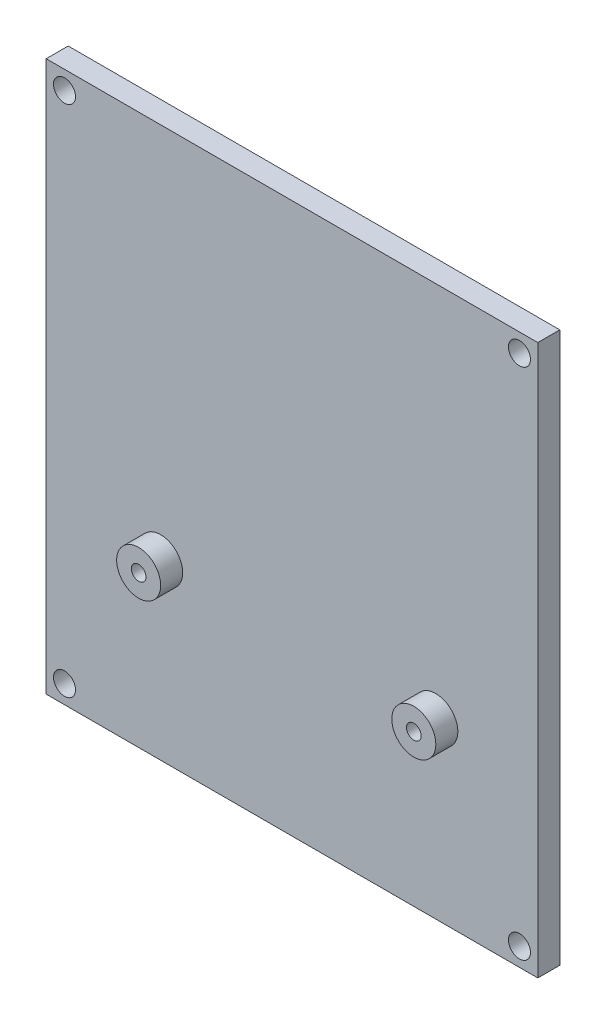
ISO-10303-21;
HEADER;
FILE_DESCRIPTION(('STEP AP214'),'2;1');
FILE_NAME('part.step','',(''),(''),'','','');
FILE_SCHEMA(('AUTOMOTIVE_DESIGN { 1 0 10303 214 1 1 1 1 }'));
ENDSEC;
DATA;
#1=APPLICATION_CONTEXT('core data for automotive mechanical design processes');
#2=APPLICATION_PROTOCOL_DEFINITION('international standard','automotive_design',2000,#1);
#3=PRODUCT_CONTEXT('',#1,'mechanical');
#4=PRODUCT('Part','Part','',(#3));
#5=PRODUCT_RELATED_PRODUCT_CATEGORY('part','',(#4));
#6=PRODUCT_DEFINITION_FORMATION('','',#4);
#7=PRODUCT_DEFINITION_CONTEXT('part definition',#1,'design');
#8=PRODUCT_DEFINITION('design','',#6,#7);
#9=PRODUCT_DEFINITION_SHAPE('','',#8);
#10=(LENGTH_UNIT() NAMED_UNIT(*) SI_UNIT(.MILLI.,.METRE.));
#11=(NAMED_UNIT(*) PLANE_ANGLE_UNIT() SI_UNIT($,.RADIAN.));
#12=(NAMED_UNIT(*) SI_UNIT($,.STERADIAN.) SOLID_ANGLE_UNIT());
#13=UNCERTAINTY_MEASURE_WITH_UNIT(LENGTH_MEASURE(1.E-05),#10,'distance_accuracy_value','');
#14=(GEOMETRIC_REPRESENTATION_CONTEXT(3) GLOBAL_UNCERTAINTY_ASSIGNED_CONTEXT((#13)) GLOBAL_UNIT_ASSIGNED_CONTEXT((#10,
#11,#12)) REPRESENTATION_CONTEXT('',''));
#15=CARTESIAN_POINT('',(0.,0.,0.));
#16=DIRECTION('',(0.,0.,1.));
#17=DIRECTION('',(1.,0.,0.));
#18=AXIS2_PLACEMENT_3D('',#15,#16,#17);
#19=CARTESIAN_POINT('',(33.5,-37.5,3.));
#20=DIRECTION('',(-1.,0.,0.));
#21=DIRECTION('',(0.,0.,1.));
#22=AXIS2_PLACEMENT_3D('',#19,#20,#21);
#23=PLANE('',#22);
#24=DIRECTION('',(0.,1.,0.));
#25=VECTOR('',#24,1.);
#26=CARTESIAN_POINT('',(33.5,-37.5,0.));
#27=LINE('',#26,#25);
#28=CARTESIAN_POINT('',(33.5,-37.5,0.));
#29=VERTEX_POINT('',#28);
#30=CARTESIAN_POINT('',(33.5,37.5,0.));
#31=VERTEX_POINT('',#30);
#32=EDGE_CURVE('E115',#29,#31,#27,.T.);
#33=ORIENTED_EDGE('',*,*,#32,.T.);
#34=DIRECTION('',(0.,0.,-1.));
#35=VECTOR('',#34,1.);
#36=CARTESIAN_POINT('',(33.5,37.5,3.));
#37=LINE('',#36,#35);
#38=CARTESIAN_POINT('',(33.5,37.5,3.));
#39=VERTEX_POINT('',#38);
#40=EDGE_CURVE('E104',#39,#31,#37,.T.);
#41=ORIENTED_EDGE('',*,*,#40,.F.);
#42=DIRECTION('',(0.,1.,0.));
#43=VECTOR('',#42,1.);
#44=CARTESIAN_POINT('',(33.5,-37.5,3.));
#45=LINE('',#44,#43);
#46=CARTESIAN_POINT('',(33.5,-37.5,3.));
#47=VERTEX_POINT('',#46);
#48=EDGE_CURVE('E96',#47,#39,#45,.T.);
#49=ORIENTED_EDGE('',*,*,#48,.F.);
#50=DIRECTION('',(0.,0.,-1.));
#51=VECTOR('',#50,1.);
#52=CARTESIAN_POINT('',(33.5,-37.5,3.));
#53=LINE('',#52,#51);
#54=EDGE_CURVE('E111',#47,#29,#53,.T.);
#55=ORIENTED_EDGE('',*,*,#54,.T.);
#56=EDGE_LOOP('',(#33,#41,#49,#55));
#57=FACE_BOUND('',#56,.T.);
#58=ADVANCED_FACE('F43',(#57),#23,.F.);
#59=CARTESIAN_POINT('',(-33.5,37.5,3.));
#60=DIRECTION('',(0.,-1.,0.));
#61=DIRECTION('',(0.,0.,-1.));
#62=AXIS2_PLACEMENT_3D('',#59,#60,#61);
#63=PLANE('',#62);
#64=DIRECTION('',(-1.,0.,0.));
#65=VECTOR('',#64,1.);
#66=CARTESIAN_POINT('',(-33.5,37.5,0.));
#67=LINE('',#66,#65);
#68=CARTESIAN_POINT('',(-33.5,37.5,0.));
#69=VERTEX_POINT('',#68);
#70=EDGE_CURVE('E102',#31,#69,#67,.T.);
#71=ORIENTED_EDGE('',*,*,#70,.T.);
#72=DIRECTION('',(0.,0.,-1.));
#73=VECTOR('',#72,1.);
#74=CARTESIAN_POINT('',(-33.5,37.5,3.));
#75=LINE('',#74,#73);
#76=CARTESIAN_POINT('',(-33.5,37.5,3.));
#77=VERTEX_POINT('',#76);
#78=EDGE_CURVE('E100',#77,#69,#75,.T.);
#79=ORIENTED_EDGE('',*,*,#78,.F.);
#80=DIRECTION('',(-1.,0.,0.));
#81=VECTOR('',#80,1.);
#82=CARTESIAN_POINT('',(-33.5,37.5,3.));
#83=LINE('',#82,#81);
#84=EDGE_CURVE('E91',#39,#77,#83,.T.);
#85=ORIENTED_EDGE('',*,*,#84,.F.);
#86=ORIENTED_EDGE('',*,*,#40,.T.);
#87=EDGE_LOOP('',(#71,#79,#85,#86));
#88=FACE_BOUND('',#87,.T.);
#89=ADVANCED_FACE('F101',(#88),#63,.F.);
#90=CARTESIAN_POINT('',(-33.5,-37.5,3.));
#91=DIRECTION('',(1.,0.,0.));
#92=DIRECTION('',(0.,0.,-1.));
#93=AXIS2_PLACEMENT_3D('',#90,#91,#92);
#94=PLANE('',#93);
#95=DIRECTION('',(0.,-1.,0.));
#96=VECTOR('',#95,1.);
#97=CARTESIAN_POINT('',(-33.5,-37.5,0.));
#98=LINE('',#97,#96);
#99=CARTESIAN_POINT('',(-33.5,-37.5,0.));
#100=VERTEX_POINT('',#99);
#101=EDGE_CURVE('E77',#69,#100,#98,.T.);
#102=ORIENTED_EDGE('',*,*,#101,.T.);
#103=DIRECTION('',(0.,0.,-1.));
#104=VECTOR('',#103,1.);
#105=CARTESIAN_POINT('',(-33.5,-37.5,3.));
#106=LINE('',#105,#104);
#107=CARTESIAN_POINT('',(-33.5,-37.5,3.));
#108=VERTEX_POINT('',#107);
#109=EDGE_CURVE('E105',#108,#100,#106,.T.);
#110=ORIENTED_EDGE('',*,*,#109,.F.);
#111=DIRECTION('',(0.,-1.,0.));
#112=VECTOR('',#111,1.);
#113=CARTESIAN_POINT('',(-33.5,-37.5,3.));
#114=LINE('',#113,#112);
#115=EDGE_CURVE('E94',#77,#108,#114,.T.);
#116=ORIENTED_EDGE('',*,*,#115,.F.);
#117=ORIENTED_EDGE('',*,*,#78,.T.);
#118=EDGE_LOOP('',(#102,#110,#116,#117));
#119=FACE_BOUND('',#118,.T.);
#120=ADVANCED_FACE('F107',(#119),#94,.F.);
#121=CARTESIAN_POINT('',(-33.5,-37.5,3.));
#122=DIRECTION('',(0.,1.,0.));
#123=DIRECTION('',(0.,0.,1.));
#124=AXIS2_PLACEMENT_3D('',#121,#122,#123);
#125=PLANE('',#124);
#126=DIRECTION('',(1.,0.,0.));
#127=VECTOR('',#126,1.);
#128=CARTESIAN_POINT('',(-33.5,-37.5,0.));
#129=LINE('',#128,#127);
#130=EDGE_CURVE('E83',#100,#29,#129,.T.);
#131=ORIENTED_EDGE('',*,*,#130,.T.);
#132=ORIENTED_EDGE('',*,*,#54,.F.);
#133=DIRECTION('',(1.,0.,0.));
#134=VECTOR('',#133,1.);
#135=CARTESIAN_POINT('',(-33.5,-37.5,3.));
#136=LINE('',#135,#134);
#137=EDGE_CURVE('E60',#108,#47,#136,.T.);
#138=ORIENTED_EDGE('',*,*,#137,.F.);
#139=ORIENTED_EDGE('',*,*,#109,.T.);
#140=EDGE_LOOP('',(#131,#132,#138,#139));
#141=FACE_BOUND('',#140,.T.);
#142=ADVANCED_FACE('F140',(#141),#125,.F.);
#143=CARTESIAN_POINT('',(0.,0.,3.));
#144=DIRECTION('',(0.,0.,-1.));
#145=DIRECTION('',(-1.,0.,0.));
#146=AXIS2_PLACEMENT_3D('',#143,#144,#145);
#147=PLANE('',#146);
#148=CARTESIAN_POINT('',(19.6004644084752,-13.8760815316985,3.));
#149=DIRECTION('',(0.,0.,-1.));
#150=DIRECTION('',(-1.,0.,0.));
#151=AXIS2_PLACEMENT_3D('',#148,#149,#150);
#152=CIRCLE('',#151,3.);
#153=CARTESIAN_POINT('',(16.6004644084752,-13.8760815316985,3.));
#154=VERTEX_POINT('',#153);
#155=EDGE_CURVE('E11',#154,#154,#152,.F.);
#156=ORIENTED_EDGE('',*,*,#155,.F.);
#157=EDGE_LOOP('',(#156));
#158=FACE_BOUND('',#157,.T.);
#159=CARTESIAN_POINT('',(-17.8995355915248,-13.8760815316985,3.));
#160=DIRECTION('',(0.,0.,-1.));
#161=DIRECTION('',(-1.,0.,0.));
#162=AXIS2_PLACEMENT_3D('',#159,#160,#161);
#163=CIRCLE('',#162,3.);
#164=CARTESIAN_POINT('',(-20.8995355915248,-13.8760815316985,3.));
#165=VERTEX_POINT('',#164);
#166=EDGE_CURVE('E52',#165,#165,#163,.F.);
#167=ORIENTED_EDGE('',*,*,#166,.F.);
#168=EDGE_LOOP('',(#167));
#169=FACE_BOUND('',#168,.T.);
#170=CARTESIAN_POINT('',(-31.,-35.,3.));
#171=DIRECTION('',(0.,0.,1.));
#172=DIRECTION('',(1.,0.,0.));
#173=AXIS2_PLACEMENT_3D('',#170,#171,#172);
#174=CIRCLE('',#173,1.5);
#175=CARTESIAN_POINT('',(-29.5,-35.,3.));
#176=VERTEX_POINT('',#175);
#177=EDGE_CURVE('E148',#176,#176,#174,.T.);
#178=ORIENTED_EDGE('',*,*,#177,.F.);
#179=EDGE_LOOP('',(#178));
#180=FACE_BOUND('',#179,.T.);
#181=CARTESIAN_POINT('',(31.,-35.,3.));
#182=DIRECTION('',(0.,0.,1.));
#183=DIRECTION('',(1.,0.,0.));
#184=AXIS2_PLACEMENT_3D('',#181,#182,#183);
#185=CIRCLE('',#184,1.5);
#186=CARTESIAN_POINT('',(32.5,-35.,3.));
#187=VERTEX_POINT('',#186);
#188=EDGE_CURVE('E152',#187,#187,#185,.T.);
#189=ORIENTED_EDGE('',*,*,#188,.F.);
#190=EDGE_LOOP('',(#189));
#191=FACE_BOUND('',#190,.T.);
#192=CARTESIAN_POINT('',(31.,35.,3.));
#193=DIRECTION('',(0.,0.,1.));
#194=DIRECTION('',(1.,0.,0.));
#195=AXIS2_PLACEMENT_3D('',#192,#193,#194);
#196=CIRCLE('',#195,1.5);
#197=CARTESIAN_POINT('',(32.5,35.,3.));
#198=VERTEX_POINT('',#197);
#199=EDGE_CURVE('E156',#198,#198,#196,.T.);
#200=ORIENTED_EDGE('',*,*,#199,.F.);
#201=EDGE_LOOP('',(#200));
#202=FACE_BOUND('',#201,.T.);
#203=CARTESIAN_POINT('',(-31.,35.,3.));
#204=DIRECTION('',(0.,0.,1.));
#205=DIRECTION('',(1.,0.,0.));
#206=AXIS2_PLACEMENT_3D('',#203,#204,#205);
#207=CIRCLE('',#206,1.5);
#208=CARTESIAN_POINT('',(-29.5,35.,3.));
#209=VERTEX_POINT('',#208);
#210=EDGE_CURVE('E159',#209,#209,#207,.T.);
#211=ORIENTED_EDGE('',*,*,#210,.F.);
#212=EDGE_LOOP('',(#211));
#213=FACE_BOUND('',#212,.T.);
#214=ORIENTED_EDGE('',*,*,#48,.T.);
#215=ORIENTED_EDGE('',*,*,#84,.T.);
#216=ORIENTED_EDGE('',*,*,#115,.T.);
#217=ORIENTED_EDGE('',*,*,#137,.T.);
#218=EDGE_LOOP('',(#214,#215,#216,#217));
#219=FACE_BOUND('',#218,.T.);
#220=ADVANCED_FACE('F92',(#158,#169,#180,#191,#202,#213,#219),#147,.F.);
#221=CARTESIAN_POINT('',(0.,0.,0.));
#222=DIRECTION('',(0.,0.,-1.));
#223=DIRECTION('',(-1.,0.,0.));
#224=AXIS2_PLACEMENT_3D('',#221,#222,#223);
#225=PLANE('',#224);
#226=CARTESIAN_POINT('',(-31.,-35.,0.));
#227=DIRECTION('',(0.,0.,1.));
#228=DIRECTION('',(1.,0.,0.));
#229=AXIS2_PLACEMENT_3D('',#226,#227,#228);
#230=CIRCLE('',#229,1.5);
#231=CARTESIAN_POINT('',(-29.5,-35.,0.));
#232=VERTEX_POINT('',#231);
#233=EDGE_CURVE('E171',#232,#232,#230,.T.);
#234=ORIENTED_EDGE('',*,*,#233,.T.);
#235=EDGE_LOOP('',(#234));
#236=FACE_BOUND('',#235,.T.);
#237=CARTESIAN_POINT('',(31.,-35.,0.));
#238=DIRECTION('',(0.,0.,1.));
#239=DIRECTION('',(1.,0.,0.));
#240=AXIS2_PLACEMENT_3D('',#237,#238,#239);
#241=CIRCLE('',#240,1.5);
#242=CARTESIAN_POINT('',(32.5,-35.,0.));
#243=VERTEX_POINT('',#242);
#244=EDGE_CURVE('E178',#243,#243,#241,.T.);
#245=ORIENTED_EDGE('',*,*,#244,.T.);
#246=EDGE_LOOP('',(#245));
#247=FACE_BOUND('',#246,.T.);
#248=CARTESIAN_POINT('',(31.,35.,0.));
#249=DIRECTION('',(0.,0.,1.));
#250=DIRECTION('',(1.,0.,0.));
#251=AXIS2_PLACEMENT_3D('',#248,#249,#250);
#252=CIRCLE('',#251,1.5);
#253=CARTESIAN_POINT('',(32.5,35.,0.));
#254=VERTEX_POINT('',#253);
#255=EDGE_CURVE('E167',#254,#254,#252,.T.);
#256=ORIENTED_EDGE('',*,*,#255,.T.);
#257=EDGE_LOOP('',(#256));
#258=FACE_BOUND('',#257,.T.);
#259=CARTESIAN_POINT('',(-31.,35.,0.));
#260=DIRECTION('',(0.,0.,1.));
#261=DIRECTION('',(1.,0.,0.));
#262=AXIS2_PLACEMENT_3D('',#259,#260,#261);
#263=CIRCLE('',#262,1.5);
#264=CARTESIAN_POINT('',(-29.5,35.,0.));
#265=VERTEX_POINT('',#264);
#266=EDGE_CURVE('E119',#265,#265,#263,.T.);
#267=ORIENTED_EDGE('',*,*,#266,.T.);
#268=EDGE_LOOP('',(#267));
#269=FACE_BOUND('',#268,.T.);
#270=ORIENTED_EDGE('',*,*,#32,.F.);
#271=ORIENTED_EDGE('',*,*,#130,.F.);
#272=ORIENTED_EDGE('',*,*,#101,.F.);
#273=ORIENTED_EDGE('',*,*,#70,.F.);
#274=EDGE_LOOP('',(#270,#271,#272,#273));
#275=FACE_BOUND('',#274,.T.);
#276=ADVANCED_FACE('F139',(#236,#247,#258,#269,#275),#225,.T.);
#277=CARTESIAN_POINT('',(-31.,35.,0.));
#278=DIRECTION('',(0.,0.,1.));
#279=DIRECTION('',(1.,0.,0.));
#280=AXIS2_PLACEMENT_3D('',#277,#278,#279);
#281=CYLINDRICAL_SURFACE('',#280,1.5);
#282=ORIENTED_EDGE('',*,*,#266,.F.);
#283=EDGE_LOOP('',(#282));
#284=FACE_BOUND('',#283,.T.);
#285=ORIENTED_EDGE('',*,*,#210,.T.);
#286=EDGE_LOOP('',(#285));
#287=FACE_BOUND('',#286,.T.);
#288=ADVANCED_FACE('F235',(#284,#287),#281,.F.);
#289=CARTESIAN_POINT('',(31.,35.,0.));
#290=DIRECTION('',(0.,0.,1.));
#291=DIRECTION('',(1.,0.,0.));
#292=AXIS2_PLACEMENT_3D('',#289,#290,#291);
#293=CYLINDRICAL_SURFACE('',#292,1.5);
#294=ORIENTED_EDGE('',*,*,#255,.F.);
#295=EDGE_LOOP('',(#294));
#296=FACE_BOUND('',#295,.T.);
#297=ORIENTED_EDGE('',*,*,#199,.T.);
#298=EDGE_LOOP('',(#297));
#299=FACE_BOUND('',#298,.T.);
#300=ADVANCED_FACE('F242',(#296,#299),#293,.F.);
#301=CARTESIAN_POINT('',(31.,-35.,0.));
#302=DIRECTION('',(0.,0.,1.));
#303=DIRECTION('',(1.,0.,0.));
#304=AXIS2_PLACEMENT_3D('',#301,#302,#303);
#305=CYLINDRICAL_SURFACE('',#304,1.5);
#306=ORIENTED_EDGE('',*,*,#244,.F.);
#307=EDGE_LOOP('',(#306));
#308=FACE_BOUND('',#307,.T.);
#309=ORIENTED_EDGE('',*,*,#188,.T.);
#310=EDGE_LOOP('',(#309));
#311=FACE_BOUND('',#310,.T.);
#312=ADVANCED_FACE('F354',(#308,#311),#305,.F.);
#313=CARTESIAN_POINT('',(-31.,-35.,0.));
#314=DIRECTION('',(0.,0.,1.));
#315=DIRECTION('',(1.,0.,0.));
#316=AXIS2_PLACEMENT_3D('',#313,#314,#315);
#317=CYLINDRICAL_SURFACE('',#316,1.5);
#318=ORIENTED_EDGE('',*,*,#233,.F.);
#319=EDGE_LOOP('',(#318));
#320=FACE_BOUND('',#319,.T.);
#321=ORIENTED_EDGE('',*,*,#177,.T.);
#322=EDGE_LOOP('',(#321));
#323=FACE_BOUND('',#322,.T.);
#324=ADVANCED_FACE('F269',(#320,#323),#317,.F.);
#325=CARTESIAN_POINT('',(-17.8995355915248,-13.8760815316985,6.));
#326=DIRECTION('',(0.,0.,1.));
#327=DIRECTION('',(1.,0.,0.));
#328=AXIS2_PLACEMENT_3D('',#325,#326,#327);
#329=PLANE('',#328);
#330=CARTESIAN_POINT('',(-17.8995355915248,-13.8760815316985,6.));
#331=DIRECTION('',(0.,0.,1.));
#332=DIRECTION('',(1.,0.,0.));
#333=AXIS2_PLACEMENT_3D('',#330,#331,#332);
#334=CIRCLE('',#333,3.);
#335=CARTESIAN_POINT('',(-14.8995355915248,-13.8760815316985,6.));
#336=VERTEX_POINT('',#335);
#337=EDGE_CURVE('E175',#336,#336,#334,.T.);
#338=ORIENTED_EDGE('',*,*,#337,.T.);
#339=EDGE_LOOP('',(#338));
#340=FACE_BOUND('',#339,.T.);
#341=CARTESIAN_POINT('',(-17.8995355915248,-13.8760815316985,6.));
#342=DIRECTION('',(0.,0.,1.));
#343=DIRECTION('',(1.,0.,0.));
#344=AXIS2_PLACEMENT_3D('',#341,#342,#343);
#345=CIRCLE('',#344,1.);
#346=CARTESIAN_POINT('',(-16.8995355915248,-13.8760815316985,6.));
#347=VERTEX_POINT('',#346);
#348=EDGE_CURVE('E190',#347,#347,#345,.T.);
#349=ORIENTED_EDGE('',*,*,#348,.F.);
#350=EDGE_LOOP('',(#349));
#351=FACE_BOUND('',#350,.T.);
#352=ADVANCED_FACE('F274',(#340,#351),#329,.T.);
#353=CARTESIAN_POINT('',(-17.8995355915248,-13.8760815316985,6.));
#354=DIRECTION('',(0.,0.,-1.));
#355=DIRECTION('',(-1.,0.,0.));
#356=AXIS2_PLACEMENT_3D('',#353,#354,#355);
#357=CYLINDRICAL_SURFACE('',#356,3.);
#358=ORIENTED_EDGE('',*,*,#337,.F.);
#359=EDGE_LOOP('',(#358));
#360=FACE_BOUND('',#359,.T.);
#361=ORIENTED_EDGE('',*,*,#166,.T.);
#362=EDGE_LOOP('',(#361));
#363=FACE_BOUND('',#362,.T.);
#364=ADVANCED_FACE('F135',(#360,#363),#357,.T.);
#365=CARTESIAN_POINT('',(-17.8995355915248,-13.8760815316985,6.));
#366=DIRECTION('',(0.,0.,-1.));
#367=DIRECTION('',(-1.,0.,0.));
#368=AXIS2_PLACEMENT_3D('',#365,#366,#367);
#369=CYLINDRICAL_SURFACE('',#368,1.);
#370=ORIENTED_EDGE('',*,*,#348,.T.);
#371=EDGE_LOOP('',(#370));
#372=FACE_BOUND('',#371,.T.);
#373=CARTESIAN_POINT('',(-17.8995355915248,-13.8760815316985,3.));
#374=DIRECTION('',(0.,0.,1.));
#375=DIRECTION('',(1.,0.,0.));
#376=AXIS2_PLACEMENT_3D('',#373,#374,#375);
#377=CIRCLE('',#376,1.);
#378=CARTESIAN_POINT('',(-16.8995355915248,-13.8760815316985,3.));
#379=VERTEX_POINT('',#378);
#380=EDGE_CURVE('E191',#379,#379,#377,.T.);
#381=ORIENTED_EDGE('',*,*,#380,.F.);
#382=EDGE_LOOP('',(#381));
#383=FACE_BOUND('',#382,.T.);
#384=ADVANCED_FACE('F291',(#372,#383),#369,.F.);
#385=ORIENTED_EDGE('',*,*,#380,.T.);
#386=EDGE_LOOP('',(#385));
#387=FACE_BOUND('',#386,.T.);
#388=ADVANCED_FACE('F144',(#387),#147,.F.);
#389=CARTESIAN_POINT('',(19.6004644084752,-13.8760815316985,6.));
#390=DIRECTION('',(0.,0.,1.));
#391=DIRECTION('',(1.,0.,0.));
#392=AXIS2_PLACEMENT_3D('',#389,#390,#391);
#393=PLANE('',#392);
#394=CARTESIAN_POINT('',(19.6004644084752,-13.8760815316985,6.));
#395=DIRECTION('',(0.,0.,1.));
#396=DIRECTION('',(1.,0.,0.));
#397=AXIS2_PLACEMENT_3D('',#394,#395,#396);
#398=CIRCLE('',#397,3.);
#399=CARTESIAN_POINT('',(22.6004644084752,-13.8760815316985,6.));
#400=VERTEX_POINT('',#399);
#401=EDGE_CURVE('E203',#400,#400,#398,.T.);
#402=ORIENTED_EDGE('',*,*,#401,.T.);
#403=EDGE_LOOP('',(#402));
#404=FACE_BOUND('',#403,.T.);
#405=CARTESIAN_POINT('',(19.6004644084752,-13.8760815316985,6.));
#406=DIRECTION('',(0.,0.,1.));
#407=DIRECTION('',(1.,0.,0.));
#408=AXIS2_PLACEMENT_3D('',#405,#406,#407);
#409=CIRCLE('',#408,1.);
#410=CARTESIAN_POINT('',(20.6004644084752,-13.8760815316985,6.));
#411=VERTEX_POINT('',#410);
#412=EDGE_CURVE('E199',#411,#411,#409,.T.);
#413=ORIENTED_EDGE('',*,*,#412,.F.);
#414=EDGE_LOOP('',(#413));
#415=FACE_BOUND('',#414,.T.);
#416=ADVANCED_FACE('F211',(#404,#415),#393,.T.);
#417=CARTESIAN_POINT('',(19.6004644084752,-13.8760815316985,6.));
#418=DIRECTION('',(0.,0.,-1.));
#419=DIRECTION('',(-1.,0.,0.));
#420=AXIS2_PLACEMENT_3D('',#417,#418,#419);
#421=CYLINDRICAL_SURFACE('',#420,3.);
#422=ORIENTED_EDGE('',*,*,#401,.F.);
#423=EDGE_LOOP('',(#422));
#424=FACE_BOUND('',#423,.T.);
#425=ORIENTED_EDGE('',*,*,#155,.T.);
#426=EDGE_LOOP('',(#425));
#427=FACE_BOUND('',#426,.T.);
#428=ADVANCED_FACE('F214',(#424,#427),#421,.T.);
#429=CARTESIAN_POINT('',(19.6004644084752,-13.8760815316985,6.));
#430=DIRECTION('',(0.,0.,-1.));
#431=DIRECTION('',(-1.,0.,0.));
#432=AXIS2_PLACEMENT_3D('',#429,#430,#431);
#433=CYLINDRICAL_SURFACE('',#432,1.);
#434=ORIENTED_EDGE('',*,*,#412,.T.);
#435=EDGE_LOOP('',(#434));
#436=FACE_BOUND('',#435,.T.);
#437=CARTESIAN_POINT('',(19.6004644084752,-13.8760815316985,3.));
#438=DIRECTION('',(0.,0.,1.));
#439=DIRECTION('',(1.,0.,0.));
#440=AXIS2_PLACEMENT_3D('',#437,#438,#439);
#441=CIRCLE('',#440,1.);
#442=CARTESIAN_POINT('',(20.6004644084752,-13.8760815316985,3.));
#443=VERTEX_POINT('',#442);
#444=EDGE_CURVE('E195',#443,#443,#441,.T.);
#445=ORIENTED_EDGE('',*,*,#444,.F.);
#446=EDGE_LOOP('',(#445));
#447=FACE_BOUND('',#446,.T.);
#448=ADVANCED_FACE('F217',(#436,#447),#433,.F.);
#449=ORIENTED_EDGE('',*,*,#444,.T.);
#450=EDGE_LOOP('',(#449));
#451=FACE_BOUND('',#450,.T.);
#452=ADVANCED_FACE('F143',(#451),#147,.F.);
#453=CLOSED_SHELL('',(#58,#89,#120,#142,#220,#276,#288,#300,#312,#324,#352,#364,#384,#388,#416,
#428,#448,#452));
#454=MANIFOLD_SOLID_BREP('B2',#453);
#455=ADVANCED_BREP_SHAPE_REPRESENTATION('',(#18,#454),#14);
#456=SHAPE_DEFINITION_REPRESENTATION(#9,#455);
ENDSEC;
END-ISO-10303-21;
